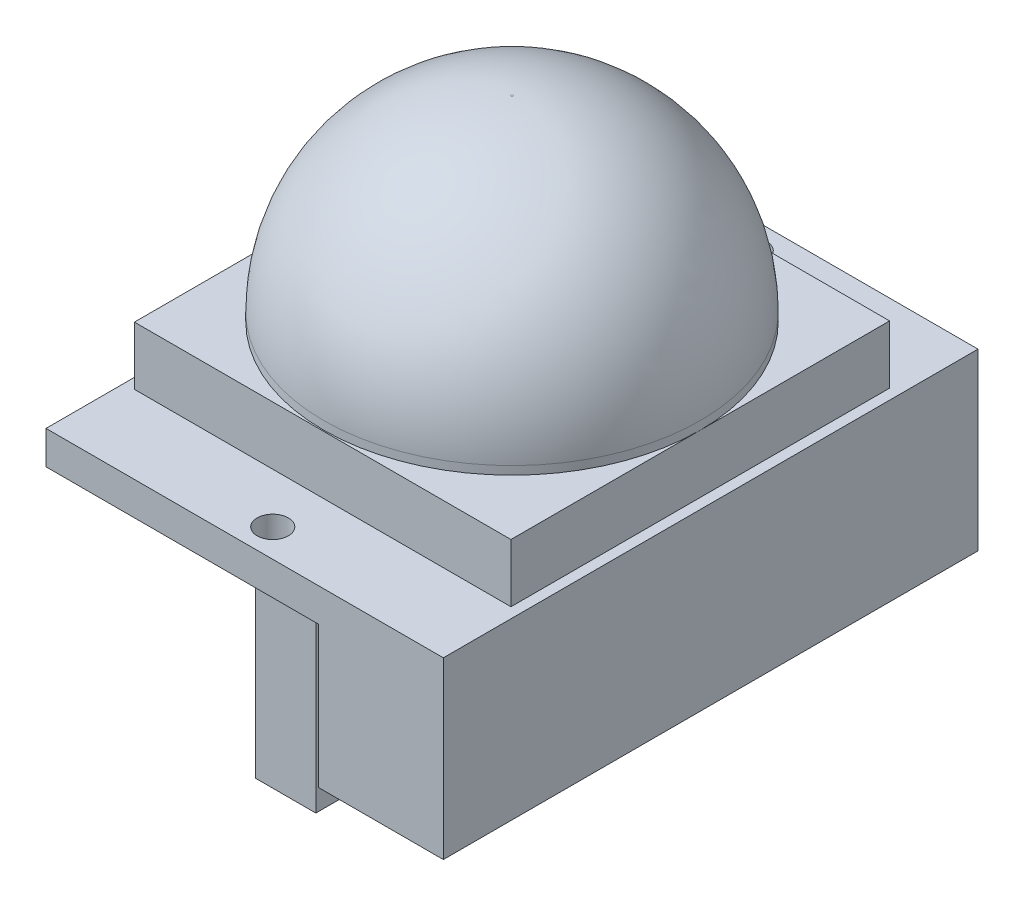
ISO-10303-21;
HEADER;
FILE_DESCRIPTION(('STEP AP214'),'2;1');
FILE_NAME('part.step','',(''),(''),'','','');
FILE_SCHEMA(('AUTOMOTIVE_DESIGN { 1 0 10303 214 1 1 1 1 }'));
ENDSEC;
DATA;
#1=APPLICATION_CONTEXT('core data for automotive mechanical design processes');
#2=APPLICATION_PROTOCOL_DEFINITION('international standard','automotive_design',2000,#1);
#3=PRODUCT_CONTEXT('',#1,'mechanical');
#4=PRODUCT('Part','Part','',(#3));
#5=PRODUCT_RELATED_PRODUCT_CATEGORY('part','',(#4));
#6=PRODUCT_DEFINITION_FORMATION('','',#4);
#7=PRODUCT_DEFINITION_CONTEXT('part definition',#1,'design');
#8=PRODUCT_DEFINITION('design','',#6,#7);
#9=PRODUCT_DEFINITION_SHAPE('','',#8);
#10=(LENGTH_UNIT() NAMED_UNIT(*) SI_UNIT(.MILLI.,.METRE.));
#11=(NAMED_UNIT(*) PLANE_ANGLE_UNIT() SI_UNIT($,.RADIAN.));
#12=(NAMED_UNIT(*) SI_UNIT($,.STERADIAN.) SOLID_ANGLE_UNIT());
#13=UNCERTAINTY_MEASURE_WITH_UNIT(LENGTH_MEASURE(1.E-05),#10,'distance_accuracy_value','');
#14=(GEOMETRIC_REPRESENTATION_CONTEXT(3) GLOBAL_UNCERTAINTY_ASSIGNED_CONTEXT((#13)) GLOBAL_UNIT_ASSIGNED_CONTEXT((#10,
#11,#12)) REPRESENTATION_CONTEXT('',''));
#15=CARTESIAN_POINT('',(0.,0.,0.));
#16=DIRECTION('',(0.,0.,1.));
#17=DIRECTION('',(1.,0.,0.));
#18=AXIS2_PLACEMENT_3D('',#15,#16,#17);
#19=CARTESIAN_POINT('',(0.,5.588,0.));
#20=DIRECTION('',(0.,1.,0.));
#21=DIRECTION('',(0.,0.,1.));
#22=AXIS2_PLACEMENT_3D('',#19,#20,#21);
#23=PLANE('',#22);
#24=CARTESIAN_POINT('',(0.,5.588,0.));
#25=DIRECTION('',(0.,1.,0.));
#26=DIRECTION('',(0.,0.,1.));
#27=AXIS2_PLACEMENT_3D('',#24,#25,#26);
#28=CIRCLE('',#27,11.4935);
#29=CARTESIAN_POINT('',(11.4935,5.588,0.));
#30=VERTEX_POINT('',#29);
#31=CARTESIAN_POINT('',(-11.4935,5.588,0.));
#32=VERTEX_POINT('',#31);
#33=EDGE_CURVE('E209',#30,#32,#28,.T.);
#34=ORIENTED_EDGE('',*,*,#33,.F.);
#35=DIRECTION('',(0.,0.,-1.));
#36=VECTOR('',#35,1.);
#37=CARTESIAN_POINT('',(11.4935,5.588,11.557));
#38=LINE('',#37,#36);
#39=CARTESIAN_POINT('',(11.4935,5.588,-11.557));
#40=VERTEX_POINT('',#39);
#41=EDGE_CURVE('E221',#30,#40,#38,.T.);
#42=ORIENTED_EDGE('',*,*,#41,.T.);
#43=DIRECTION('',(-1.,0.,0.));
#44=VECTOR('',#43,1.);
#45=CARTESIAN_POINT('',(11.4935,5.588,-11.557));
#46=LINE('',#45,#44);
#47=CARTESIAN_POINT('',(-11.4935,5.588,-11.557));
#48=VERTEX_POINT('',#47);
#49=EDGE_CURVE('E227',#40,#48,#46,.T.);
#50=ORIENTED_EDGE('',*,*,#49,.T.);
#51=DIRECTION('',(0.,0.,1.));
#52=VECTOR('',#51,1.);
#53=CARTESIAN_POINT('',(-11.4935,5.588,11.557));
#54=LINE('',#53,#52);
#55=EDGE_CURVE('E216',#48,#32,#54,.T.);
#56=ORIENTED_EDGE('',*,*,#55,.T.);
#57=EDGE_LOOP('',(#34,#42,#50,#56));
#58=FACE_BOUND('',#57,.T.);
#59=ADVANCED_FACE('F44',(#58),#23,.T.);
#60=CARTESIAN_POINT('',(0.,2.032,0.));
#61=DIRECTION('',(0.,-1.,0.));
#62=DIRECTION('',(0.,0.,-1.));
#63=AXIS2_PLACEMENT_3D('',#60,#61,#62);
#64=PLANE('',#63);
#65=DIRECTION('',(0.,0.,-1.));
#66=VECTOR('',#65,1.);
#67=CARTESIAN_POINT('',(12.1285,2.032,16.3195));
#68=LINE('',#67,#66);
#69=CARTESIAN_POINT('',(12.1285,2.032,16.3195));
#70=VERTEX_POINT('',#69);
#71=CARTESIAN_POINT('',(12.1285,2.032,-16.3195));
#72=VERTEX_POINT('',#71);
#73=EDGE_CURVE('E271',#70,#72,#68,.T.);
#74=ORIENTED_EDGE('',*,*,#73,.T.);
#75=DIRECTION('',(-1.,0.,0.));
#76=VECTOR('',#75,1.);
#77=CARTESIAN_POINT('',(-12.1285,2.032,-16.3195));
#78=LINE('',#77,#76);
#79=CARTESIAN_POINT('',(-12.1285,2.032,-16.3195));
#80=VERTEX_POINT('',#79);
#81=EDGE_CURVE('E274',#72,#80,#78,.T.);
#82=ORIENTED_EDGE('',*,*,#81,.T.);
#83=DIRECTION('',(0.,0.,1.));
#84=VECTOR('',#83,1.);
#85=CARTESIAN_POINT('',(-12.1285,2.032,16.3195));
#86=LINE('',#85,#84);
#87=CARTESIAN_POINT('',(-12.1285,2.032,16.3195));
#88=VERTEX_POINT('',#87);
#89=EDGE_CURVE('E276',#80,#88,#86,.T.);
#90=ORIENTED_EDGE('',*,*,#89,.T.);
#91=DIRECTION('',(1.,0.,0.));
#92=VECTOR('',#91,1.);
#93=CARTESIAN_POINT('',(-12.1285,2.032,16.3195));
#94=LINE('',#93,#92);
#95=EDGE_CURVE('E284',#88,#70,#94,.T.);
#96=ORIENTED_EDGE('',*,*,#95,.T.);
#97=EDGE_LOOP('',(#74,#82,#90,#96));
#98=FACE_BOUND('',#97,.T.);
#99=CARTESIAN_POINT('',(0.,2.032,14.605));
#100=DIRECTION('',(0.,1.,0.));
#101=DIRECTION('',(0.,0.,1.));
#102=AXIS2_PLACEMENT_3D('',#99,#100,#101);
#103=CIRCLE('',#102,0.9525);
#104=CARTESIAN_POINT('',(0.,2.032,15.5575));
#105=VERTEX_POINT('',#104);
#106=EDGE_CURVE('E265',#105,#105,#103,.T.);
#107=ORIENTED_EDGE('',*,*,#106,.F.);
#108=EDGE_LOOP('',(#107));
#109=FACE_BOUND('',#108,.T.);
#110=CARTESIAN_POINT('',(0.,2.032,-14.605));
#111=DIRECTION('',(0.,1.,0.));
#112=DIRECTION('',(0.,0.,1.));
#113=AXIS2_PLACEMENT_3D('',#110,#111,#112);
#114=CIRCLE('',#113,0.9525);
#115=CARTESIAN_POINT('',(0.,2.032,-13.6525));
#116=VERTEX_POINT('',#115);
#117=EDGE_CURVE('E263',#116,#116,#114,.T.);
#118=ORIENTED_EDGE('',*,*,#117,.F.);
#119=EDGE_LOOP('',(#118));
#120=FACE_BOUND('',#119,.T.);
#121=DIRECTION('',(0.,0.,1.));
#122=VECTOR('',#121,1.);
#123=CARTESIAN_POINT('',(-11.4935,2.032,11.557));
#124=LINE('',#123,#122);
#125=CARTESIAN_POINT('',(-11.4935,2.032,-11.557));
#126=VERTEX_POINT('',#125);
#127=CARTESIAN_POINT('',(-11.4935,2.032,11.557));
#128=VERTEX_POINT('',#127);
#129=EDGE_CURVE('E212',#126,#128,#124,.T.);
#130=ORIENTED_EDGE('',*,*,#129,.F.);
#131=DIRECTION('',(-1.,0.,0.));
#132=VECTOR('',#131,1.);
#133=CARTESIAN_POINT('',(11.4935,2.032,-11.557));
#134=LINE('',#133,#132);
#135=CARTESIAN_POINT('',(11.4935,2.032,-11.557));
#136=VERTEX_POINT('',#135);
#137=EDGE_CURVE('E242',#136,#126,#134,.T.);
#138=ORIENTED_EDGE('',*,*,#137,.F.);
#139=DIRECTION('',(0.,0.,-1.));
#140=VECTOR('',#139,1.);
#141=CARTESIAN_POINT('',(11.4935,2.032,11.557));
#142=LINE('',#141,#140);
#143=CARTESIAN_POINT('',(11.4935,2.032,11.557));
#144=VERTEX_POINT('',#143);
#145=EDGE_CURVE('E239',#144,#136,#142,.T.);
#146=ORIENTED_EDGE('',*,*,#145,.F.);
#147=DIRECTION('',(1.,0.,0.));
#148=VECTOR('',#147,1.);
#149=CARTESIAN_POINT('',(11.4935,2.032,11.557));
#150=LINE('',#149,#148);
#151=EDGE_CURVE('E235',#128,#144,#150,.T.);
#152=ORIENTED_EDGE('',*,*,#151,.F.);
#153=EDGE_LOOP('',(#130,#138,#146,#152));
#154=FACE_BOUND('',#153,.T.);
#155=ADVANCED_FACE('F340',(#98,#109,#120,#154),#64,.F.);
#156=CARTESIAN_POINT('',(12.1285,2.032,16.3195));
#157=DIRECTION('',(-1.,0.,0.));
#158=DIRECTION('',(0.,0.,1.));
#159=AXIS2_PLACEMENT_3D('',#156,#157,#158);
#160=PLANE('',#159);
#161=DIRECTION('',(0.,-1.,0.));
#162=VECTOR('',#161,1.);
#163=CARTESIAN_POINT('',(12.1285,2.032,16.3195));
#164=LINE('',#163,#162);
#165=CARTESIAN_POINT('',(12.1285,-8.636,16.3195));
#166=VERTEX_POINT('',#165);
#167=EDGE_CURVE('E281',#70,#166,#164,.T.);
#168=ORIENTED_EDGE('',*,*,#167,.T.);
#169=DIRECTION('',(0.,0.,1.));
#170=VECTOR('',#169,1.);
#171=CARTESIAN_POINT('',(12.1285,-8.636,16.3195));
#172=LINE('',#171,#170);
#173=CARTESIAN_POINT('',(12.1285,-8.636,-16.3195));
#174=VERTEX_POINT('',#173);
#175=EDGE_CURVE('E181',#174,#166,#172,.T.);
#176=ORIENTED_EDGE('',*,*,#175,.F.);
#177=DIRECTION('',(0.,-1.,0.));
#178=VECTOR('',#177,1.);
#179=CARTESIAN_POINT('',(12.1285,2.032,-16.3195));
#180=LINE('',#179,#178);
#181=EDGE_CURVE('E303',#72,#174,#180,.T.);
#182=ORIENTED_EDGE('',*,*,#181,.F.);
#183=ORIENTED_EDGE('',*,*,#73,.F.);
#184=EDGE_LOOP('',(#168,#176,#182,#183));
#185=FACE_BOUND('',#184,.T.);
#186=ADVANCED_FACE('F374',(#185),#160,.F.);
#187=CARTESIAN_POINT('',(-12.1285,2.032,-16.3195));
#188=DIRECTION('',(0.,0.,1.));
#189=DIRECTION('',(1.,0.,0.));
#190=AXIS2_PLACEMENT_3D('',#187,#188,#189);
#191=PLANE('',#190);
#192=ORIENTED_EDGE('',*,*,#181,.T.);
#193=DIRECTION('',(1.,0.,0.));
#194=VECTOR('',#193,1.);
#195=CARTESIAN_POINT('',(12.1285,-8.636,-16.3195));
#196=LINE('',#195,#194);
#197=CARTESIAN_POINT('',(4.5085,-8.636,-16.3195));
#198=VERTEX_POINT('',#197);
#199=EDGE_CURVE('E196',#198,#174,#196,.T.);
#200=ORIENTED_EDGE('',*,*,#199,.F.);
#201=DIRECTION('',(0.,1.,0.));
#202=VECTOR('',#201,1.);
#203=CARTESIAN_POINT('',(4.5085,-8.636,-16.3195));
#204=LINE('',#203,#202);
#205=CARTESIAN_POINT('',(4.5085,0.,-16.3195));
#206=VERTEX_POINT('',#205);
#207=EDGE_CURVE('E203',#198,#206,#204,.T.);
#208=ORIENTED_EDGE('',*,*,#207,.T.);
#209=DIRECTION('',(-1.,0.,0.));
#210=VECTOR('',#209,1.);
#211=CARTESIAN_POINT('',(-12.1285,0.,-16.3195));
#212=LINE('',#211,#210);
#213=CARTESIAN_POINT('',(-12.1285,0.,-16.3195));
#214=VERTEX_POINT('',#213);
#215=EDGE_CURVE('E286',#206,#214,#212,.T.);
#216=ORIENTED_EDGE('',*,*,#215,.T.);
#217=DIRECTION('',(0.,-1.,0.));
#218=VECTOR('',#217,1.);
#219=CARTESIAN_POINT('',(-12.1285,2.032,-16.3195));
#220=LINE('',#219,#218);
#221=EDGE_CURVE('E301',#80,#214,#220,.T.);
#222=ORIENTED_EDGE('',*,*,#221,.F.);
#223=ORIENTED_EDGE('',*,*,#81,.F.);
#224=EDGE_LOOP('',(#192,#200,#208,#216,#222,#223));
#225=FACE_BOUND('',#224,.T.);
#226=ADVANCED_FACE('F527',(#225),#191,.F.);
#227=CARTESIAN_POINT('',(-12.1285,2.032,16.3195));
#228=DIRECTION('',(1.,0.,0.));
#229=DIRECTION('',(0.,0.,-1.));
#230=AXIS2_PLACEMENT_3D('',#227,#228,#229);
#231=PLANE('',#230);
#232=DIRECTION('',(0.,0.,1.));
#233=VECTOR('',#232,1.);
#234=CARTESIAN_POINT('',(-12.1285,0.,16.3195));
#235=LINE('',#234,#233);
#236=CARTESIAN_POINT('',(-12.1285,0.,-4.09087532007061));
#237=VERTEX_POINT('',#236);
#238=EDGE_CURVE('E179',#214,#237,#235,.T.);
#239=ORIENTED_EDGE('',*,*,#238,.T.);
#240=DIRECTION('',(0.,1.,0.));
#241=VECTOR('',#240,1.);
#242=CARTESIAN_POINT('',(-12.1285,-22.86,-4.09087532007061));
#243=LINE('',#242,#241);
#244=CARTESIAN_POINT('',(-12.1285,-22.86,-4.09087532007061));
#245=VERTEX_POINT('',#244);
#246=EDGE_CURVE('E160',#245,#237,#243,.T.);
#247=ORIENTED_EDGE('',*,*,#246,.F.);
#248=DIRECTION('',(0.,0.,-1.));
#249=VECTOR('',#248,1.);
#250=CARTESIAN_POINT('',(-12.1285,-22.86,3.52912467992939));
#251=LINE('',#250,#249);
#252=CARTESIAN_POINT('',(-12.1285,-22.86,3.52912467992939));
#253=VERTEX_POINT('',#252);
#254=EDGE_CURVE('E165',#253,#245,#251,.T.);
#255=ORIENTED_EDGE('',*,*,#254,.F.);
#256=DIRECTION('',(0.,1.,0.));
#257=VECTOR('',#256,1.);
#258=CARTESIAN_POINT('',(-12.1285,-22.86,3.52912467992939));
#259=LINE('',#258,#257);
#260=CARTESIAN_POINT('',(-12.1285,0.,3.52912467992939));
#261=VERTEX_POINT('',#260);
#262=EDGE_CURVE('E353',#253,#261,#259,.T.);
#263=ORIENTED_EDGE('',*,*,#262,.T.);
#264=CARTESIAN_POINT('',(-12.1285,0.,16.3195));
#265=VERTEX_POINT('',#264);
#266=EDGE_CURVE('E288',#261,#265,#235,.T.);
#267=ORIENTED_EDGE('',*,*,#266,.T.);
#268=DIRECTION('',(0.,-1.,0.));
#269=VECTOR('',#268,1.);
#270=CARTESIAN_POINT('',(-12.1285,2.032,16.3195));
#271=LINE('',#270,#269);
#272=EDGE_CURVE('E299',#88,#265,#271,.T.);
#273=ORIENTED_EDGE('',*,*,#272,.F.);
#274=ORIENTED_EDGE('',*,*,#89,.F.);
#275=ORIENTED_EDGE('',*,*,#221,.T.);
#276=EDGE_LOOP('',(#239,#247,#255,#263,#267,#273,#274,#275));
#277=FACE_BOUND('',#276,.T.);
#278=ADVANCED_FACE('F171',(#277),#231,.F.);
#279=CARTESIAN_POINT('',(-12.1285,2.032,16.3195));
#280=DIRECTION('',(0.,0.,-1.));
#281=DIRECTION('',(-1.,0.,0.));
#282=AXIS2_PLACEMENT_3D('',#279,#280,#281);
#283=PLANE('',#282);
#284=DIRECTION('',(1.,0.,0.));
#285=VECTOR('',#284,1.);
#286=CARTESIAN_POINT('',(-12.1285,0.,16.3195));
#287=LINE('',#286,#285);
#288=CARTESIAN_POINT('',(4.5085,0.,16.3195));
#289=VERTEX_POINT('',#288);
#290=EDGE_CURVE('E277',#265,#289,#287,.T.);
#291=ORIENTED_EDGE('',*,*,#290,.T.);
#292=DIRECTION('',(0.,1.,0.));
#293=VECTOR('',#292,1.);
#294=CARTESIAN_POINT('',(4.50849999999999,-8.636,16.3195));
#295=LINE('',#294,#293);
#296=CARTESIAN_POINT('',(4.50849999999999,-8.636,16.3195));
#297=VERTEX_POINT('',#296);
#298=EDGE_CURVE('E206',#297,#289,#295,.T.);
#299=ORIENTED_EDGE('',*,*,#298,.F.);
#300=DIRECTION('',(-1.,0.,0.));
#301=VECTOR('',#300,1.);
#302=CARTESIAN_POINT('',(12.1285,-8.636,16.3195));
#303=LINE('',#302,#301);
#304=EDGE_CURVE('E192',#166,#297,#303,.T.);
#305=ORIENTED_EDGE('',*,*,#304,.F.);
#306=ORIENTED_EDGE('',*,*,#167,.F.);
#307=ORIENTED_EDGE('',*,*,#95,.F.);
#308=ORIENTED_EDGE('',*,*,#272,.T.);
#309=EDGE_LOOP('',(#291,#299,#305,#306,#307,#308));
#310=FACE_BOUND('',#309,.T.);
#311=ADVANCED_FACE('F355',(#310),#283,.F.);
#312=CARTESIAN_POINT('',(0.,0.,0.));
#313=DIRECTION('',(0.,-1.,0.));
#314=DIRECTION('',(0.,0.,-1.));
#315=AXIS2_PLACEMENT_3D('',#312,#313,#314);
#316=PLANE('',#315);
#317=DIRECTION('',(-1.,0.,0.));
#318=VECTOR('',#317,1.);
#319=CARTESIAN_POINT('',(-12.1285,0.,3.52912467992939));
#320=LINE('',#319,#318);
#321=CARTESIAN_POINT('',(-8.4455,0.,3.52912467992939));
#322=VERTEX_POINT('',#321);
#323=EDGE_CURVE('E174',#322,#261,#320,.T.);
#324=ORIENTED_EDGE('',*,*,#323,.F.);
#325=DIRECTION('',(0.,0.,1.));
#326=VECTOR('',#325,1.);
#327=CARTESIAN_POINT('',(-8.4455,0.,3.52912467992939));
#328=LINE('',#327,#326);
#329=CARTESIAN_POINT('',(-8.4455,0.,-4.09087532007061));
#330=VERTEX_POINT('',#329);
#331=EDGE_CURVE('E586',#330,#322,#328,.T.);
#332=ORIENTED_EDGE('',*,*,#331,.F.);
#333=DIRECTION('',(1.,0.,0.));
#334=VECTOR('',#333,1.);
#335=CARTESIAN_POINT('',(-12.1285,0.,-4.09087532007061));
#336=LINE('',#335,#334);
#337=EDGE_CURVE('E590',#237,#330,#336,.T.);
#338=ORIENTED_EDGE('',*,*,#337,.F.);
#339=ORIENTED_EDGE('',*,*,#238,.F.);
#340=ORIENTED_EDGE('',*,*,#215,.F.);
#341=DIRECTION('',(0.,0.,-1.));
#342=VECTOR('',#341,1.);
#343=CARTESIAN_POINT('',(4.50849999999999,0.,16.3195));
#344=LINE('',#343,#342);
#345=EDGE_CURVE('E68',#289,#206,#344,.T.);
#346=ORIENTED_EDGE('',*,*,#345,.F.);
#347=ORIENTED_EDGE('',*,*,#290,.F.);
#348=ORIENTED_EDGE('',*,*,#266,.F.);
#349=EDGE_LOOP('',(#324,#332,#338,#339,#340,#346,#347,#348));
#350=FACE_BOUND('',#349,.T.);
#351=CARTESIAN_POINT('',(0.,0.,-14.605));
#352=DIRECTION('',(0.,-1.,0.));
#353=DIRECTION('',(0.,0.,-1.));
#354=AXIS2_PLACEMENT_3D('',#351,#352,#353);
#355=CIRCLE('',#354,0.9525);
#356=CARTESIAN_POINT('',(0.,0.,-15.5575));
#357=VERTEX_POINT('',#356);
#358=EDGE_CURVE('E290',#357,#357,#355,.T.);
#359=ORIENTED_EDGE('',*,*,#358,.F.);
#360=EDGE_LOOP('',(#359));
#361=FACE_BOUND('',#360,.T.);
#362=CARTESIAN_POINT('',(0.,0.,14.605));
#363=DIRECTION('',(0.,-1.,0.));
#364=DIRECTION('',(0.,0.,-1.));
#365=AXIS2_PLACEMENT_3D('',#362,#363,#364);
#366=CIRCLE('',#365,0.9525);
#367=CARTESIAN_POINT('',(0.,0.,13.6525));
#368=VERTEX_POINT('',#367);
#369=EDGE_CURVE('E270',#368,#368,#366,.T.);
#370=ORIENTED_EDGE('',*,*,#369,.F.);
#371=EDGE_LOOP('',(#370));
#372=FACE_BOUND('',#371,.T.);
#373=ADVANCED_FACE('F357',(#350,#361,#372),#316,.T.);
#374=CARTESIAN_POINT('',(0.,-0.4572,14.605));
#375=DIRECTION('',(0.,1.,0.));
#376=DIRECTION('',(0.,0.,1.));
#377=AXIS2_PLACEMENT_3D('',#374,#375,#376);
#378=CYLINDRICAL_SURFACE('',#377,0.9525);
#379=ORIENTED_EDGE('',*,*,#369,.T.);
#380=EDGE_LOOP('',(#379));
#381=FACE_BOUND('',#380,.T.);
#382=ORIENTED_EDGE('',*,*,#106,.T.);
#383=EDGE_LOOP('',(#382));
#384=FACE_BOUND('',#383,.T.);
#385=ADVANCED_FACE('F363',(#381,#384),#378,.F.);
#386=CARTESIAN_POINT('',(0.,-0.4572,-14.605));
#387=DIRECTION('',(0.,1.,0.));
#388=DIRECTION('',(0.,0.,1.));
#389=AXIS2_PLACEMENT_3D('',#386,#387,#388);
#390=CYLINDRICAL_SURFACE('',#389,0.9525);
#391=ORIENTED_EDGE('',*,*,#358,.T.);
#392=EDGE_LOOP('',(#391));
#393=FACE_BOUND('',#392,.T.);
#394=ORIENTED_EDGE('',*,*,#117,.T.);
#395=EDGE_LOOP('',(#394));
#396=FACE_BOUND('',#395,.T.);
#397=ADVANCED_FACE('F369',(#393,#396),#390,.F.);
#398=CARTESIAN_POINT('',(-11.4935,5.588,11.557));
#399=DIRECTION('',(1.,0.,0.));
#400=DIRECTION('',(0.,0.,-1.));
#401=AXIS2_PLACEMENT_3D('',#398,#399,#400);
#402=PLANE('',#401);
#403=ORIENTED_EDGE('',*,*,#129,.T.);
#404=DIRECTION('',(0.,-1.,0.));
#405=VECTOR('',#404,1.);
#406=CARTESIAN_POINT('',(-11.4935,5.588,11.557));
#407=LINE('',#406,#405);
#408=CARTESIAN_POINT('',(-11.4935,5.588,11.557));
#409=VERTEX_POINT('',#408);
#410=EDGE_CURVE('E256',#409,#128,#407,.T.);
#411=ORIENTED_EDGE('',*,*,#410,.F.);
#412=EDGE_CURVE('E222',#32,#409,#54,.T.);
#413=ORIENTED_EDGE('',*,*,#412,.F.);
#414=ORIENTED_EDGE('',*,*,#55,.F.);
#415=DIRECTION('',(0.,-1.,0.));
#416=VECTOR('',#415,1.);
#417=CARTESIAN_POINT('',(-11.4935,5.588,-11.557));
#418=LINE('',#417,#416);
#419=EDGE_CURVE('E231',#48,#126,#418,.T.);
#420=ORIENTED_EDGE('',*,*,#419,.T.);
#421=EDGE_LOOP('',(#403,#411,#413,#414,#420));
#422=FACE_BOUND('',#421,.T.);
#423=ADVANCED_FACE('F329',(#422),#402,.F.);
#424=CARTESIAN_POINT('',(11.4935,5.588,11.557));
#425=DIRECTION('',(0.,0.,-1.));
#426=DIRECTION('',(-1.,0.,0.));
#427=AXIS2_PLACEMENT_3D('',#424,#425,#426);
#428=PLANE('',#427);
#429=ORIENTED_EDGE('',*,*,#151,.T.);
#430=DIRECTION('',(0.,-1.,0.));
#431=VECTOR('',#430,1.);
#432=CARTESIAN_POINT('',(11.4935,5.588,11.557));
#433=LINE('',#432,#431);
#434=CARTESIAN_POINT('',(11.4935,5.588,11.557));
#435=VERTEX_POINT('',#434);
#436=EDGE_CURVE('E255',#435,#144,#433,.T.);
#437=ORIENTED_EDGE('',*,*,#436,.F.);
#438=DIRECTION('',(1.,0.,0.));
#439=VECTOR('',#438,1.);
#440=CARTESIAN_POINT('',(11.4935,5.588,11.557));
#441=LINE('',#440,#439);
#442=EDGE_CURVE('E219',#409,#435,#441,.T.);
#443=ORIENTED_EDGE('',*,*,#442,.F.);
#444=ORIENTED_EDGE('',*,*,#410,.T.);
#445=EDGE_LOOP('',(#429,#437,#443,#444));
#446=FACE_BOUND('',#445,.T.);
#447=ADVANCED_FACE('F342',(#446),#428,.F.);
#448=CARTESIAN_POINT('',(11.4935,5.588,11.557));
#449=DIRECTION('',(-1.,0.,0.));
#450=DIRECTION('',(0.,0.,1.));
#451=AXIS2_PLACEMENT_3D('',#448,#449,#450);
#452=PLANE('',#451);
#453=ORIENTED_EDGE('',*,*,#145,.T.);
#454=DIRECTION('',(0.,-1.,0.));
#455=VECTOR('',#454,1.);
#456=CARTESIAN_POINT('',(11.4935,5.588,-11.557));
#457=LINE('',#456,#455);
#458=EDGE_CURVE('E250',#40,#136,#457,.T.);
#459=ORIENTED_EDGE('',*,*,#458,.F.);
#460=ORIENTED_EDGE('',*,*,#41,.F.);
#461=EDGE_CURVE('E223',#435,#30,#38,.T.);
#462=ORIENTED_EDGE('',*,*,#461,.F.);
#463=ORIENTED_EDGE('',*,*,#436,.T.);
#464=EDGE_LOOP('',(#453,#459,#460,#462,#463));
#465=FACE_BOUND('',#464,.T.);
#466=ADVANCED_FACE('F343',(#465),#452,.F.);
#467=CARTESIAN_POINT('',(11.4935,5.588,-11.557));
#468=DIRECTION('',(0.,0.,1.));
#469=DIRECTION('',(1.,0.,0.));
#470=AXIS2_PLACEMENT_3D('',#467,#468,#469);
#471=PLANE('',#470);
#472=ORIENTED_EDGE('',*,*,#137,.T.);
#473=ORIENTED_EDGE('',*,*,#419,.F.);
#474=ORIENTED_EDGE('',*,*,#49,.F.);
#475=ORIENTED_EDGE('',*,*,#458,.T.);
#476=EDGE_LOOP('',(#472,#473,#474,#475));
#477=FACE_BOUND('',#476,.T.);
#478=ADVANCED_FACE('F339',(#477),#471,.F.);
#479=EDGE_CURVE('E214',#32,#30,#28,.T.);
#480=ORIENTED_EDGE('',*,*,#479,.F.);
#481=ORIENTED_EDGE('',*,*,#412,.T.);
#482=ORIENTED_EDGE('',*,*,#442,.T.);
#483=ORIENTED_EDGE('',*,*,#461,.T.);
#484=EDGE_LOOP('',(#480,#481,#482,#483));
#485=FACE_BOUND('',#484,.T.);
#486=ADVANCED_FACE('F323',(#485),#23,.T.);
#487=CARTESIAN_POINT('',(0.,17.526,0.));
#488=DIRECTION('',(0.,-1.,0.));
#489=DIRECTION('',(0.,0.,-1.));
#490=AXIS2_PLACEMENT_3D('',#487,#488,#489);
#491=CYLINDRICAL_SURFACE('',#490,11.4935);
#492=CARTESIAN_POINT('',(0.,6.096,0.));
#493=DIRECTION('',(0.,1.,0.));
#494=DIRECTION('',(0.,0.,1.));
#495=AXIS2_PLACEMENT_3D('',#492,#493,#494);
#496=CIRCLE('',#495,11.4935);
#497=CARTESIAN_POINT('',(0.,6.096,11.4935));
#498=VERTEX_POINT('',#497);
#499=EDGE_CURVE('E11',#498,#498,#496,.F.);
#500=ORIENTED_EDGE('',*,*,#499,.T.);
#501=EDGE_LOOP('',(#500));
#502=FACE_BOUND('',#501,.T.);
#503=ORIENTED_EDGE('',*,*,#33,.T.);
#504=ORIENTED_EDGE('',*,*,#479,.T.);
#505=EDGE_LOOP('',(#503,#504));
#506=FACE_BOUND('',#505,.T.);
#507=ADVANCED_FACE('F317',(#502,#506),#491,.T.);
#508=CARTESIAN_POINT('',(0.,17.526,0.));
#509=DIRECTION('',(0.,1.,0.));
#510=DIRECTION('',(0.,0.,1.));
#511=AXIS2_PLACEMENT_3D('',#508,#509,#510);
#512=PLANE('',#511);
#513=CARTESIAN_POINT('',(0.,17.526,0.));
#514=DIRECTION('',(0.,1.,0.));
#515=DIRECTION('',(0.,0.,1.));
#516=AXIS2_PLACEMENT_3D('',#513,#514,#515);
#517=CIRCLE('',#516,0.0635000000000011);
#518=CARTESIAN_POINT('',(0.,17.526,0.0635000000000011));
#519=VERTEX_POINT('',#518);
#520=EDGE_CURVE('E53',#519,#519,#517,.T.);
#521=ORIENTED_EDGE('',*,*,#520,.T.);
#522=EDGE_LOOP('',(#521));
#523=FACE_BOUND('',#522,.T.);
#524=ADVANCED_FACE('F398',(#523),#512,.T.);
#525=CARTESIAN_POINT('',(0.,6.096,0.));
#526=DIRECTION('',(0.,1.,0.));
#527=DIRECTION('',(0.,0.,1.));
#528=AXIS2_PLACEMENT_3D('',#525,#526,#527);
#529=DEGENERATE_TOROIDAL_SURFACE('',#528,0.0635000000000011,11.43,.T.);
#530=ORIENTED_EDGE('',*,*,#499,.F.);
#531=EDGE_LOOP('',(#530));
#532=FACE_BOUND('',#531,.T.);
#533=ORIENTED_EDGE('',*,*,#520,.F.);
#534=EDGE_LOOP('',(#533));
#535=FACE_BOUND('',#534,.T.);
#536=ADVANCED_FACE('F50',(#532,#535),#529,.T.);
#537=CARTESIAN_POINT('',(4.50849999999999,-8.636,16.3195));
#538=DIRECTION('',(1.,0.,0.));
#539=DIRECTION('',(0.,0.,-1.));
#540=AXIS2_PLACEMENT_3D('',#537,#538,#539);
#541=PLANE('',#540);
#542=ORIENTED_EDGE('',*,*,#345,.T.);
#543=ORIENTED_EDGE('',*,*,#207,.F.);
#544=DIRECTION('',(0.,0.,-1.));
#545=VECTOR('',#544,1.);
#546=CARTESIAN_POINT('',(4.50849999999999,-8.636,16.3195));
#547=LINE('',#546,#545);
#548=EDGE_CURVE('E195',#297,#198,#547,.T.);
#549=ORIENTED_EDGE('',*,*,#548,.F.);
#550=ORIENTED_EDGE('',*,*,#298,.T.);
#551=EDGE_LOOP('',(#542,#543,#549,#550));
#552=FACE_BOUND('',#551,.T.);
#553=ADVANCED_FACE('F458',(#552),#541,.F.);
#554=CARTESIAN_POINT('',(0.,-8.636,0.));
#555=DIRECTION('',(0.,1.,0.));
#556=DIRECTION('',(0.,0.,1.));
#557=AXIS2_PLACEMENT_3D('',#554,#555,#556);
#558=PLANE('',#557);
#559=ORIENTED_EDGE('',*,*,#175,.T.);
#560=ORIENTED_EDGE('',*,*,#304,.T.);
#561=ORIENTED_EDGE('',*,*,#548,.T.);
#562=ORIENTED_EDGE('',*,*,#199,.T.);
#563=EDGE_LOOP('',(#559,#560,#561,#562));
#564=FACE_BOUND('',#563,.T.);
#565=ADVANCED_FACE('F468',(#564),#558,.F.);
#566=CARTESIAN_POINT('',(-12.1285,-22.86,-4.09087532007061));
#567=DIRECTION('',(0.,0.,1.));
#568=DIRECTION('',(1.,0.,0.));
#569=AXIS2_PLACEMENT_3D('',#566,#567,#568);
#570=PLANE('',#569);
#571=ORIENTED_EDGE('',*,*,#337,.T.);
#572=DIRECTION('',(0.,1.,0.));
#573=VECTOR('',#572,1.);
#574=CARTESIAN_POINT('',(-8.4455,-22.86,-4.09087532007061));
#575=LINE('',#574,#573);
#576=CARTESIAN_POINT('',(-8.4455,-22.86,-4.09087532007061));
#577=VERTEX_POINT('',#576);
#578=EDGE_CURVE('E63',#577,#330,#575,.T.);
#579=ORIENTED_EDGE('',*,*,#578,.F.);
#580=DIRECTION('',(1.,0.,0.));
#581=VECTOR('',#580,1.);
#582=CARTESIAN_POINT('',(-12.1285,-22.86,-4.09087532007061));
#583=LINE('',#582,#581);
#584=EDGE_CURVE('E153',#245,#577,#583,.T.);
#585=ORIENTED_EDGE('',*,*,#584,.F.);
#586=ORIENTED_EDGE('',*,*,#246,.T.);
#587=EDGE_LOOP('',(#571,#579,#585,#586));
#588=FACE_BOUND('',#587,.T.);
#589=ADVANCED_FACE('F154',(#588),#570,.F.);
#590=CARTESIAN_POINT('',(-8.4455,-22.86,3.52912467992939));
#591=DIRECTION('',(-1.,0.,0.));
#592=DIRECTION('',(0.,0.,1.));
#593=AXIS2_PLACEMENT_3D('',#590,#591,#592);
#594=PLANE('',#593);
#595=ORIENTED_EDGE('',*,*,#331,.T.);
#596=DIRECTION('',(0.,1.,0.));
#597=VECTOR('',#596,1.);
#598=CARTESIAN_POINT('',(-8.4455,-22.86,3.52912467992939));
#599=LINE('',#598,#597);
#600=CARTESIAN_POINT('',(-8.4455,-22.86,3.52912467992939));
#601=VERTEX_POINT('',#600);
#602=EDGE_CURVE('E183',#601,#322,#599,.T.);
#603=ORIENTED_EDGE('',*,*,#602,.F.);
#604=DIRECTION('',(0.,0.,1.));
#605=VECTOR('',#604,1.);
#606=CARTESIAN_POINT('',(-8.4455,-22.86,3.52912467992939));
#607=LINE('',#606,#605);
#608=EDGE_CURVE('E161',#577,#601,#607,.T.);
#609=ORIENTED_EDGE('',*,*,#608,.F.);
#610=ORIENTED_EDGE('',*,*,#578,.T.);
#611=EDGE_LOOP('',(#595,#603,#609,#610));
#612=FACE_BOUND('',#611,.T.);
#613=ADVANCED_FACE('F488',(#612),#594,.F.);
#614=CARTESIAN_POINT('',(-12.1285,-22.86,3.52912467992939));
#615=DIRECTION('',(0.,0.,-1.));
#616=DIRECTION('',(-1.,0.,0.));
#617=AXIS2_PLACEMENT_3D('',#614,#615,#616);
#618=PLANE('',#617);
#619=ORIENTED_EDGE('',*,*,#323,.T.);
#620=ORIENTED_EDGE('',*,*,#262,.F.);
#621=DIRECTION('',(-1.,0.,0.));
#622=VECTOR('',#621,1.);
#623=CARTESIAN_POINT('',(-12.1285,-22.86,3.52912467992939));
#624=LINE('',#623,#622);
#625=EDGE_CURVE('E170',#601,#253,#624,.T.);
#626=ORIENTED_EDGE('',*,*,#625,.F.);
#627=ORIENTED_EDGE('',*,*,#602,.T.);
#628=EDGE_LOOP('',(#619,#620,#626,#627));
#629=FACE_BOUND('',#628,.T.);
#630=ADVANCED_FACE('F497',(#629),#618,.F.);
#631=CARTESIAN_POINT('',(0.,-22.86,0.));
#632=DIRECTION('',(0.,-1.,0.));
#633=DIRECTION('',(0.,0.,-1.));
#634=AXIS2_PLACEMENT_3D('',#631,#632,#633);
#635=PLANE('',#634);
#636=ORIENTED_EDGE('',*,*,#254,.T.);
#637=ORIENTED_EDGE('',*,*,#584,.T.);
#638=ORIENTED_EDGE('',*,*,#608,.T.);
#639=ORIENTED_EDGE('',*,*,#625,.T.);
#640=EDGE_LOOP('',(#636,#637,#638,#639));
#641=FACE_BOUND('',#640,.T.);
#642=ADVANCED_FACE('F164',(#641),#635,.T.);
#643=CLOSED_SHELL('',(#59,#155,#186,#226,#278,#311,#373,#385,#397,#423,#447,#466,#478,#486,#507,
#524,#536,#553,#565,#589,#613,#630,#642));
#644=MANIFOLD_SOLID_BREP('B2',#643);
#645=ADVANCED_BREP_SHAPE_REPRESENTATION('',(#18,#644),#14);
#646=SHAPE_DEFINITION_REPRESENTATION(#9,#645);
ENDSEC;
END-ISO-10303-21;
